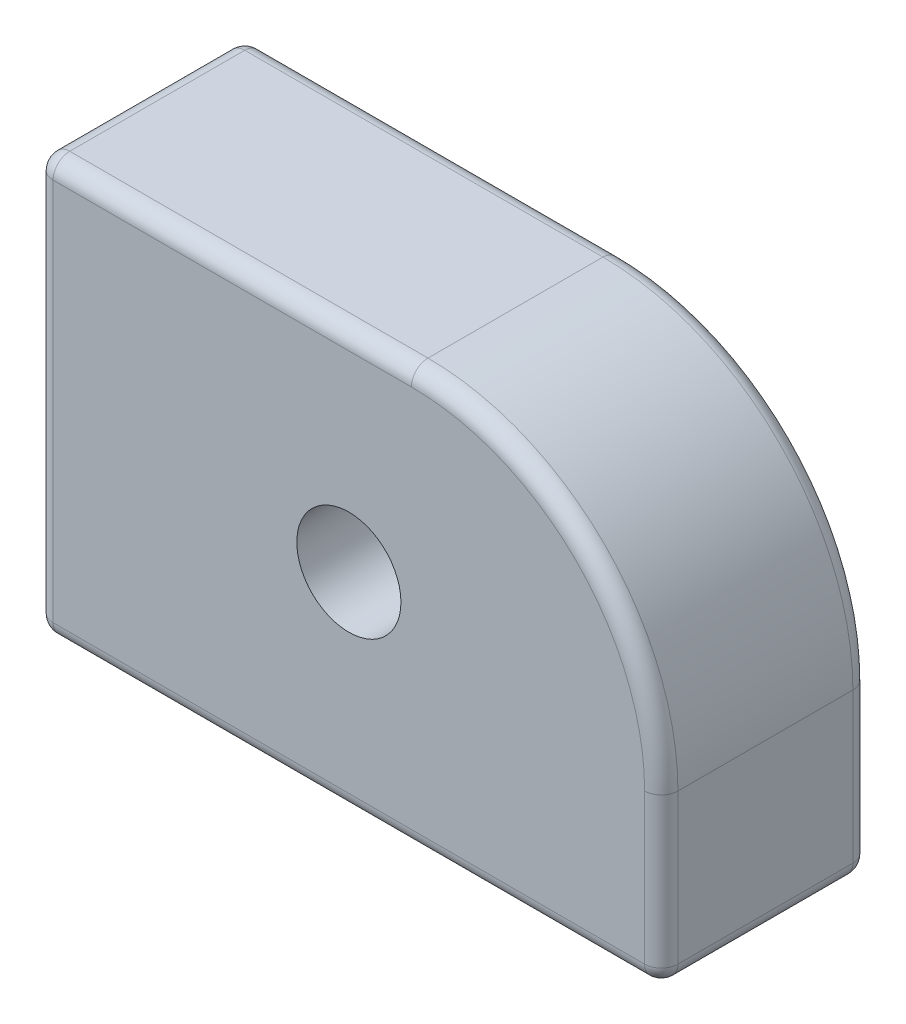
ISO-10303-21;
HEADER;
FILE_DESCRIPTION(('STEP AP214'),'2;1');
FILE_NAME('part.step','',(''),(''),'','','');
FILE_SCHEMA(('AUTOMOTIVE_DESIGN { 1 0 10303 214 1 1 1 1 }'));
ENDSEC;
DATA;
#1=APPLICATION_CONTEXT('core data for automotive mechanical design processes');
#2=APPLICATION_PROTOCOL_DEFINITION('international standard','automotive_design',2000,#1);
#3=PRODUCT_CONTEXT('',#1,'mechanical');
#4=PRODUCT('Part','Part','',(#3));
#5=PRODUCT_RELATED_PRODUCT_CATEGORY('part','',(#4));
#6=PRODUCT_DEFINITION_FORMATION('','',#4);
#7=PRODUCT_DEFINITION_CONTEXT('part definition',#1,'design');
#8=PRODUCT_DEFINITION('design','',#6,#7);
#9=PRODUCT_DEFINITION_SHAPE('','',#8);
#10=(LENGTH_UNIT() NAMED_UNIT(*) SI_UNIT(.MILLI.,.METRE.));
#11=(NAMED_UNIT(*) PLANE_ANGLE_UNIT() SI_UNIT($,.RADIAN.));
#12=(NAMED_UNIT(*) SI_UNIT($,.STERADIAN.) SOLID_ANGLE_UNIT());
#13=UNCERTAINTY_MEASURE_WITH_UNIT(LENGTH_MEASURE(1.E-05),#10,'distance_accuracy_value','');
#14=(GEOMETRIC_REPRESENTATION_CONTEXT(3) GLOBAL_UNCERTAINTY_ASSIGNED_CONTEXT((#13)) GLOBAL_UNIT_ASSIGNED_CONTEXT((#10,
#11,#12)) REPRESENTATION_CONTEXT('',''));
#15=CARTESIAN_POINT('',(0.,0.,0.));
#16=DIRECTION('',(0.,0.,1.));
#17=DIRECTION('',(1.,0.,0.));
#18=AXIS2_PLACEMENT_3D('',#15,#16,#17);
#19=CARTESIAN_POINT('',(-75.,50.,-25.));
#20=DIRECTION('',(0.,1.,0.));
#21=DIRECTION('',(0.,0.,1.));
#22=AXIS2_PLACEMENT_3D('',#19,#20,#21);
#23=PLANE('',#22);
#24=DIRECTION('',(0.,0.,1.));
#25=VECTOR('',#24,1.);
#26=CARTESIAN_POINT('',(-71.,50.,-25.));
#27=LINE('',#26,#25);
#28=CARTESIAN_POINT('',(-71.,50.,-21.));
#29=VERTEX_POINT('',#28);
#30=CARTESIAN_POINT('',(-71.,50.,21.));
#31=VERTEX_POINT('',#30);
#32=EDGE_CURVE('E193',#29,#31,#27,.T.);
#33=ORIENTED_EDGE('',*,*,#32,.T.);
#34=DIRECTION('',(-1.,0.,0.));
#35=VECTOR('',#34,1.);
#36=CARTESIAN_POINT('',(14.9999999999996,50.,21.));
#37=LINE('',#36,#35);
#38=CARTESIAN_POINT('',(14.9999999999996,50.,21.));
#39=VERTEX_POINT('',#38);
#40=EDGE_CURVE('E195',#31,#39,#37,.F.);
#41=ORIENTED_EDGE('',*,*,#40,.T.);
#42=DIRECTION('',(0.,0.,1.));
#43=VECTOR('',#42,1.);
#44=CARTESIAN_POINT('',(14.9999999999996,50.,-25.));
#45=LINE('',#44,#43);
#46=CARTESIAN_POINT('',(14.9999999999996,50.,-21.));
#47=VERTEX_POINT('',#46);
#48=EDGE_CURVE('E152',#47,#39,#45,.T.);
#49=ORIENTED_EDGE('',*,*,#48,.F.);
#50=DIRECTION('',(-1.,0.,0.));
#51=VECTOR('',#50,1.);
#52=CARTESIAN_POINT('',(-75.,50.,-21.));
#53=LINE('',#52,#51);
#54=EDGE_CURVE('E191',#47,#29,#53,.T.);
#55=ORIENTED_EDGE('',*,*,#54,.T.);
#56=EDGE_LOOP('',(#33,#41,#49,#55));
#57=FACE_BOUND('',#56,.T.);
#58=ADVANCED_FACE('F35',(#57),#23,.T.);
#59=CARTESIAN_POINT('',(15.,-9.99999999999999,-25.));
#60=DIRECTION('',(0.,0.,1.));
#61=DIRECTION('',(1.,0.,0.));
#62=AXIS2_PLACEMENT_3D('',#59,#60,#61);
#63=CYLINDRICAL_SURFACE('',#62,60.);
#64=ORIENTED_EDGE('',*,*,#48,.T.);
#65=CARTESIAN_POINT('',(15.,-9.99999999999999,21.));
#66=DIRECTION('',(0.,0.,-1.));
#67=DIRECTION('',(-1.,0.,0.));
#68=AXIS2_PLACEMENT_3D('',#65,#66,#67);
#69=CIRCLE('',#68,60.);
#70=CARTESIAN_POINT('',(75.,-10.0000000000004,21.));
#71=VERTEX_POINT('',#70);
#72=EDGE_CURVE('E139',#39,#71,#69,.T.);
#73=ORIENTED_EDGE('',*,*,#72,.T.);
#74=DIRECTION('',(0.,0.,1.));
#75=VECTOR('',#74,1.);
#76=CARTESIAN_POINT('',(75.,-10.0000000000004,-25.));
#77=LINE('',#76,#75);
#78=CARTESIAN_POINT('',(75.,-10.0000000000004,-21.));
#79=VERTEX_POINT('',#78);
#80=EDGE_CURVE('E274',#79,#71,#77,.T.);
#81=ORIENTED_EDGE('',*,*,#80,.F.);
#82=CARTESIAN_POINT('',(15.,-9.99999999999999,-21.));
#83=DIRECTION('',(0.,0.,-1.));
#84=DIRECTION('',(-1.,0.,0.));
#85=AXIS2_PLACEMENT_3D('',#82,#83,#84);
#86=CIRCLE('',#85,60.);
#87=EDGE_CURVE('E159',#79,#47,#86,.F.);
#88=ORIENTED_EDGE('',*,*,#87,.T.);
#89=EDGE_LOOP('',(#64,#73,#81,#88));
#90=FACE_BOUND('',#89,.T.);
#91=ADVANCED_FACE('F297',(#90),#63,.T.);
#92=CARTESIAN_POINT('',(75.,-10.0000000000004,-25.));
#93=DIRECTION('',(1.,0.,0.));
#94=DIRECTION('',(0.,0.,-1.));
#95=AXIS2_PLACEMENT_3D('',#92,#93,#94);
#96=PLANE('',#95);
#97=ORIENTED_EDGE('',*,*,#80,.T.);
#98=DIRECTION('',(0.,1.,0.));
#99=VECTOR('',#98,1.);
#100=CARTESIAN_POINT('',(75.,-50.,21.));
#101=LINE('',#100,#99);
#102=CARTESIAN_POINT('',(75.,-46.,21.));
#103=VERTEX_POINT('',#102);
#104=EDGE_CURVE('E171',#71,#103,#101,.F.);
#105=ORIENTED_EDGE('',*,*,#104,.T.);
#106=DIRECTION('',(0.,0.,1.));
#107=VECTOR('',#106,1.);
#108=CARTESIAN_POINT('',(75.,-46.,-25.));
#109=LINE('',#108,#107);
#110=CARTESIAN_POINT('',(75.,-46.,-21.));
#111=VERTEX_POINT('',#110);
#112=EDGE_CURVE('E169',#103,#111,#109,.F.);
#113=ORIENTED_EDGE('',*,*,#112,.T.);
#114=DIRECTION('',(0.,1.,0.));
#115=VECTOR('',#114,1.);
#116=CARTESIAN_POINT('',(75.,-10.0000000000004,-21.));
#117=LINE('',#116,#115);
#118=EDGE_CURVE('E167',#111,#79,#117,.T.);
#119=ORIENTED_EDGE('',*,*,#118,.T.);
#120=EDGE_LOOP('',(#97,#105,#113,#119));
#121=FACE_BOUND('',#120,.T.);
#122=ADVANCED_FACE('F300',(#121),#96,.T.);
#123=CARTESIAN_POINT('',(-75.,-50.,-25.));
#124=DIRECTION('',(0.,-1.,0.));
#125=DIRECTION('',(1.,0.,0.));
#126=AXIS2_PLACEMENT_3D('',#123,#124,#125);
#127=PLANE('',#126);
#128=DIRECTION('',(1.,0.,0.));
#129=VECTOR('',#128,1.);
#130=CARTESIAN_POINT('',(-75.,-50.,21.));
#131=LINE('',#130,#129);
#132=CARTESIAN_POINT('',(71.,-50.,21.));
#133=VERTEX_POINT('',#132);
#134=CARTESIAN_POINT('',(-71.,-50.,21.));
#135=VERTEX_POINT('',#134);
#136=EDGE_CURVE('E177',#133,#135,#131,.F.);
#137=ORIENTED_EDGE('',*,*,#136,.T.);
#138=DIRECTION('',(0.,0.,1.));
#139=VECTOR('',#138,1.);
#140=CARTESIAN_POINT('',(-71.,-50.,-25.));
#141=LINE('',#140,#139);
#142=CARTESIAN_POINT('',(-71.,-50.,-21.));
#143=VERTEX_POINT('',#142);
#144=EDGE_CURVE('E180',#135,#143,#141,.F.);
#145=ORIENTED_EDGE('',*,*,#144,.T.);
#146=DIRECTION('',(1.,0.,0.));
#147=VECTOR('',#146,1.);
#148=CARTESIAN_POINT('',(-75.,-50.,-21.));
#149=LINE('',#148,#147);
#150=CARTESIAN_POINT('',(71.,-50.,-21.));
#151=VERTEX_POINT('',#150);
#152=EDGE_CURVE('E175',#143,#151,#149,.T.);
#153=ORIENTED_EDGE('',*,*,#152,.T.);
#154=DIRECTION('',(0.,0.,1.));
#155=VECTOR('',#154,1.);
#156=CARTESIAN_POINT('',(71.,-50.,-25.));
#157=LINE('',#156,#155);
#158=EDGE_CURVE('E173',#151,#133,#157,.T.);
#159=ORIENTED_EDGE('',*,*,#158,.T.);
#160=EDGE_LOOP('',(#137,#145,#153,#159));
#161=FACE_BOUND('',#160,.T.);
#162=ADVANCED_FACE('F311',(#161),#127,.T.);
#163=CARTESIAN_POINT('',(-75.,-50.,-25.));
#164=DIRECTION('',(-1.,0.,0.));
#165=DIRECTION('',(0.,0.,1.));
#166=AXIS2_PLACEMENT_3D('',#163,#164,#165);
#167=PLANE('',#166);
#168=DIRECTION('',(0.,-1.,0.));
#169=VECTOR('',#168,1.);
#170=CARTESIAN_POINT('',(-75.,-50.,-21.));
#171=LINE('',#170,#169);
#172=CARTESIAN_POINT('',(-75.,46.,-21.));
#173=VERTEX_POINT('',#172);
#174=CARTESIAN_POINT('',(-75.,-46.,-21.));
#175=VERTEX_POINT('',#174);
#176=EDGE_CURVE('E184',#173,#175,#171,.T.);
#177=ORIENTED_EDGE('',*,*,#176,.T.);
#178=DIRECTION('',(0.,0.,1.));
#179=VECTOR('',#178,1.);
#180=CARTESIAN_POINT('',(-75.,-46.,-25.));
#181=LINE('',#180,#179);
#182=CARTESIAN_POINT('',(-75.,-46.,21.));
#183=VERTEX_POINT('',#182);
#184=EDGE_CURVE('E189',#175,#183,#181,.T.);
#185=ORIENTED_EDGE('',*,*,#184,.T.);
#186=DIRECTION('',(0.,-1.,0.));
#187=VECTOR('',#186,1.);
#188=CARTESIAN_POINT('',(-75.,50.,21.));
#189=LINE('',#188,#187);
#190=CARTESIAN_POINT('',(-75.,46.,21.));
#191=VERTEX_POINT('',#190);
#192=EDGE_CURVE('E186',#183,#191,#189,.F.);
#193=ORIENTED_EDGE('',*,*,#192,.T.);
#194=DIRECTION('',(0.,0.,1.));
#195=VECTOR('',#194,1.);
#196=CARTESIAN_POINT('',(-75.,46.,-25.));
#197=LINE('',#196,#195);
#198=EDGE_CURVE('E182',#191,#173,#197,.F.);
#199=ORIENTED_EDGE('',*,*,#198,.T.);
#200=EDGE_LOOP('',(#177,#185,#193,#199));
#201=FACE_BOUND('',#200,.T.);
#202=CARTESIAN_POINT('',(-75.,0.,0.));
#203=DIRECTION('',(-1.,0.,0.));
#204=DIRECTION('',(0.,0.,1.));
#205=AXIS2_PLACEMENT_3D('',#202,#203,#204);
#206=CIRCLE('',#205,15.);
#207=CARTESIAN_POINT('',(-75.,0.,15.));
#208=VERTEX_POINT('',#207);
#209=EDGE_CURVE('E258',#208,#208,#206,.T.);
#210=ORIENTED_EDGE('',*,*,#209,.F.);
#211=EDGE_LOOP('',(#210));
#212=FACE_BOUND('',#211,.T.);
#213=ADVANCED_FACE('F352',(#201,#212),#167,.T.);
#214=CARTESIAN_POINT('',(15.,-9.99999999999999,-25.));
#215=DIRECTION('',(0.,0.,-1.));
#216=DIRECTION('',(-1.,0.,0.));
#217=AXIS2_PLACEMENT_3D('',#214,#215,#216);
#218=PLANE('',#217);
#219=DIRECTION('',(0.,1.,0.));
#220=VECTOR('',#219,1.);
#221=CARTESIAN_POINT('',(71.,-9.99999999999999,-25.));
#222=LINE('',#221,#220);
#223=CARTESIAN_POINT('',(71.,-10.0000000000004,-25.));
#224=VERTEX_POINT('',#223);
#225=CARTESIAN_POINT('',(71.,-46.,-25.));
#226=VERTEX_POINT('',#225);
#227=EDGE_CURVE('E58',#224,#226,#222,.F.);
#228=ORIENTED_EDGE('',*,*,#227,.T.);
#229=DIRECTION('',(1.,0.,0.));
#230=VECTOR('',#229,1.);
#231=CARTESIAN_POINT('',(15.,-46.,-25.));
#232=LINE('',#231,#230);
#233=CARTESIAN_POINT('',(-71.,-46.,-25.));
#234=VERTEX_POINT('',#233);
#235=EDGE_CURVE('E11',#226,#234,#232,.F.);
#236=ORIENTED_EDGE('',*,*,#235,.T.);
#237=DIRECTION('',(0.,-1.,0.));
#238=VECTOR('',#237,1.);
#239=CARTESIAN_POINT('',(-71.,-9.99999999999999,-25.));
#240=LINE('',#239,#238);
#241=CARTESIAN_POINT('',(-71.,46.,-25.));
#242=VERTEX_POINT('',#241);
#243=EDGE_CURVE('E44',#234,#242,#240,.F.);
#244=ORIENTED_EDGE('',*,*,#243,.T.);
#245=DIRECTION('',(-1.,0.,0.));
#246=VECTOR('',#245,1.);
#247=CARTESIAN_POINT('',(15.,46.,-25.));
#248=LINE('',#247,#246);
#249=CARTESIAN_POINT('',(14.9999999999996,46.,-25.));
#250=VERTEX_POINT('',#249);
#251=EDGE_CURVE('E197',#242,#250,#248,.F.);
#252=ORIENTED_EDGE('',*,*,#251,.T.);
#253=CARTESIAN_POINT('',(15.,-9.99999999999999,-25.));
#254=DIRECTION('',(0.,0.,-1.));
#255=DIRECTION('',(-1.,0.,0.));
#256=AXIS2_PLACEMENT_3D('',#253,#254,#255);
#257=CIRCLE('',#256,56.);
#258=EDGE_CURVE('E199',#250,#224,#257,.T.);
#259=ORIENTED_EDGE('',*,*,#258,.T.);
#260=EDGE_LOOP('',(#228,#236,#244,#252,#259));
#261=FACE_BOUND('',#260,.T.);
#262=CARTESIAN_POINT('',(0.,0.,-25.));
#263=DIRECTION('',(0.,0.,1.));
#264=DIRECTION('',(1.,0.,0.));
#265=AXIS2_PLACEMENT_3D('',#262,#263,#264);
#266=CIRCLE('',#265,12.5);
#267=CARTESIAN_POINT('',(12.5,0.,-25.));
#268=VERTEX_POINT('',#267);
#269=EDGE_CURVE('E271',#268,#268,#266,.T.);
#270=ORIENTED_EDGE('',*,*,#269,.T.);
#271=EDGE_LOOP('',(#270));
#272=FACE_BOUND('',#271,.T.);
#273=ADVANCED_FACE('F314',(#261,#272),#218,.T.);
#274=CARTESIAN_POINT('',(15.,-9.99999999999999,25.));
#275=DIRECTION('',(0.,0.,-1.));
#276=DIRECTION('',(-1.,0.,0.));
#277=AXIS2_PLACEMENT_3D('',#274,#275,#276);
#278=PLANE('',#277);
#279=DIRECTION('',(0.,1.,0.));
#280=VECTOR('',#279,1.);
#281=CARTESIAN_POINT('',(71.,-10.0000000000004,25.));
#282=LINE('',#281,#280);
#283=CARTESIAN_POINT('',(71.,-46.,25.));
#284=VERTEX_POINT('',#283);
#285=CARTESIAN_POINT('',(71.,-10.0000000000004,25.));
#286=VERTEX_POINT('',#285);
#287=EDGE_CURVE('E157',#284,#286,#282,.T.);
#288=ORIENTED_EDGE('',*,*,#287,.T.);
#289=CARTESIAN_POINT('',(15.,-9.99999999999999,25.));
#290=DIRECTION('',(0.,0.,-1.));
#291=DIRECTION('',(-1.,0.,0.));
#292=AXIS2_PLACEMENT_3D('',#289,#290,#291);
#293=CIRCLE('',#292,56.);
#294=CARTESIAN_POINT('',(14.9999999999996,46.,25.));
#295=VERTEX_POINT('',#294);
#296=EDGE_CURVE('E137',#286,#295,#293,.F.);
#297=ORIENTED_EDGE('',*,*,#296,.T.);
#298=DIRECTION('',(-1.,0.,0.));
#299=VECTOR('',#298,1.);
#300=CARTESIAN_POINT('',(-75.,46.,25.));
#301=LINE('',#300,#299);
#302=CARTESIAN_POINT('',(-71.,46.,25.));
#303=VERTEX_POINT('',#302);
#304=EDGE_CURVE('E145',#295,#303,#301,.T.);
#305=ORIENTED_EDGE('',*,*,#304,.T.);
#306=DIRECTION('',(0.,-1.,0.));
#307=VECTOR('',#306,1.);
#308=CARTESIAN_POINT('',(-71.,-50.,25.));
#309=LINE('',#308,#307);
#310=CARTESIAN_POINT('',(-71.,-46.,25.));
#311=VERTEX_POINT('',#310);
#312=EDGE_CURVE('E151',#303,#311,#309,.T.);
#313=ORIENTED_EDGE('',*,*,#312,.T.);
#314=DIRECTION('',(1.,0.,0.));
#315=VECTOR('',#314,1.);
#316=CARTESIAN_POINT('',(75.,-46.,25.));
#317=LINE('',#316,#315);
#318=EDGE_CURVE('E162',#311,#284,#317,.T.);
#319=ORIENTED_EDGE('',*,*,#318,.T.);
#320=EDGE_LOOP('',(#288,#297,#305,#313,#319));
#321=FACE_BOUND('',#320,.T.);
#322=CARTESIAN_POINT('',(0.,0.,25.));
#323=DIRECTION('',(0.,0.,1.));
#324=DIRECTION('',(1.,0.,0.));
#325=AXIS2_PLACEMENT_3D('',#322,#323,#324);
#326=CIRCLE('',#325,12.5);
#327=CARTESIAN_POINT('',(12.5,0.,25.));
#328=VERTEX_POINT('',#327);
#329=EDGE_CURVE('E268',#328,#328,#326,.T.);
#330=ORIENTED_EDGE('',*,*,#329,.F.);
#331=EDGE_LOOP('',(#330));
#332=FACE_BOUND('',#331,.T.);
#333=ADVANCED_FACE('F154',(#321,#332),#278,.F.);
#334=CARTESIAN_POINT('',(0.,0.,-25.));
#335=DIRECTION('',(0.,0.,1.));
#336=DIRECTION('',(1.,0.,0.));
#337=AXIS2_PLACEMENT_3D('',#334,#335,#336);
#338=CYLINDRICAL_SURFACE('',#337,12.5);
#339=ORIENTED_EDGE('',*,*,#269,.F.);
#340=EDGE_LOOP('',(#339));
#341=FACE_BOUND('',#340,.T.);
#342=ORIENTED_EDGE('',*,*,#329,.T.);
#343=EDGE_LOOP('',(#342));
#344=FACE_BOUND('',#343,.T.);
#345=ADVANCED_FACE('F520',(#341,#344),#338,.F.);
#346=CARTESIAN_POINT('',(-15.,0.,0.));
#347=DIRECTION('',(-1.,0.,0.));
#348=DIRECTION('',(0.,0.,1.));
#349=AXIS2_PLACEMENT_3D('',#346,#347,#348);
#350=CYLINDRICAL_SURFACE('',#349,15.);
#351=CARTESIAN_POINT('',(-15.,0.,0.));
#352=DIRECTION('',(-1.,0.,0.));
#353=DIRECTION('',(0.,0.,1.));
#354=AXIS2_PLACEMENT_3D('',#351,#352,#353);
#355=CIRCLE('',#354,15.);
#356=CARTESIAN_POINT('',(-15.,0.,15.));
#357=VERTEX_POINT('',#356);
#358=EDGE_CURVE('E263',#357,#357,#355,.T.);
#359=ORIENTED_EDGE('',*,*,#358,.F.);
#360=EDGE_LOOP('',(#359));
#361=FACE_BOUND('',#360,.T.);
#362=ORIENTED_EDGE('',*,*,#209,.T.);
#363=EDGE_LOOP('',(#362));
#364=FACE_BOUND('',#363,.T.);
#365=ADVANCED_FACE('F511',(#361,#364),#350,.F.);
#366=CARTESIAN_POINT('',(-15.,0.,0.));
#367=DIRECTION('',(-1.,0.,0.));
#368=DIRECTION('',(0.,0.,1.));
#369=AXIS2_PLACEMENT_3D('',#366,#367,#368);
#370=PLANE('',#369);
#371=ORIENTED_EDGE('',*,*,#358,.T.);
#372=EDGE_LOOP('',(#371));
#373=FACE_BOUND('',#372,.T.);
#374=ADVANCED_FACE('F342',(#373),#370,.T.);
#375=CARTESIAN_POINT('',(-71.,-46.,-21.));
#376=DIRECTION('',(0.,0.,1.));
#377=DIRECTION('',(1.,0.,0.));
#378=AXIS2_PLACEMENT_3D('',#375,#376,#377);
#379=SPHERICAL_SURFACE('',#378,4.);
#380=CARTESIAN_POINT('',(-71.,-46.,-21.));
#381=DIRECTION('',(0.,-1.,0.));
#382=DIRECTION('',(0.,0.,-1.));
#383=AXIS2_PLACEMENT_3D('',#380,#381,#382);
#384=CIRCLE('',#383,4.);
#385=EDGE_CURVE('E248',#234,#175,#384,.F.);
#386=ORIENTED_EDGE('',*,*,#385,.F.);
#387=CARTESIAN_POINT('',(-71.,-46.,-21.));
#388=DIRECTION('',(-1.,0.,0.));
#389=DIRECTION('',(0.,0.,1.));
#390=AXIS2_PLACEMENT_3D('',#387,#388,#389);
#391=CIRCLE('',#390,4.);
#392=EDGE_CURVE('E252',#143,#234,#391,.F.);
#393=ORIENTED_EDGE('',*,*,#392,.F.);
#394=CARTESIAN_POINT('',(-71.,-46.,-21.));
#395=DIRECTION('',(0.,0.,-1.));
#396=DIRECTION('',(-1.,0.,0.));
#397=AXIS2_PLACEMENT_3D('',#394,#395,#396);
#398=CIRCLE('',#397,4.);
#399=EDGE_CURVE('E250',#175,#143,#398,.F.);
#400=ORIENTED_EDGE('',*,*,#399,.F.);
#401=EDGE_LOOP('',(#386,#393,#400));
#402=FACE_BOUND('',#401,.T.);
#403=ADVANCED_FACE('F37',(#402),#379,.T.);
#404=CARTESIAN_POINT('',(15.,-9.99999999999999,-21.));
#405=DIRECTION('',(0.,0.,-1.));
#406=DIRECTION('',(-1.,0.,0.));
#407=AXIS2_PLACEMENT_3D('',#404,#405,#406);
#408=TOROIDAL_SURFACE('',#407,56.,4.);
#409=CARTESIAN_POINT('',(14.9999999999996,46.,-21.));
#410=DIRECTION('',(-1.,0.,0.));
#411=DIRECTION('',(0.,-1.,0.));
#412=AXIS2_PLACEMENT_3D('',#409,#410,#411);
#413=CIRCLE('',#412,4.);
#414=EDGE_CURVE('E245',#47,#250,#413,.T.);
#415=ORIENTED_EDGE('',*,*,#414,.F.);
#416=ORIENTED_EDGE('',*,*,#87,.F.);
#417=CARTESIAN_POINT('',(71.,-10.0000000000004,-21.));
#418=DIRECTION('',(0.,-1.,0.));
#419=DIRECTION('',(0.,0.,-1.));
#420=AXIS2_PLACEMENT_3D('',#417,#418,#419);
#421=CIRCLE('',#420,4.);
#422=EDGE_CURVE('E39',#224,#79,#421,.T.);
#423=ORIENTED_EDGE('',*,*,#422,.F.);
#424=ORIENTED_EDGE('',*,*,#258,.F.);
#425=EDGE_LOOP('',(#415,#416,#423,#424));
#426=FACE_BOUND('',#425,.T.);
#427=ADVANCED_FACE('F335',(#426),#408,.T.);
#428=CARTESIAN_POINT('',(71.,-10.0000000000004,-21.));
#429=DIRECTION('',(0.,1.,0.));
#430=DIRECTION('',(0.,0.,1.));
#431=AXIS2_PLACEMENT_3D('',#428,#429,#430);
#432=CYLINDRICAL_SURFACE('',#431,4.);
#433=ORIENTED_EDGE('',*,*,#422,.T.);
#434=ORIENTED_EDGE('',*,*,#118,.F.);
#435=CARTESIAN_POINT('',(71.,-46.,-21.));
#436=DIRECTION('',(0.,-1.,0.));
#437=DIRECTION('',(0.,0.,-1.));
#438=AXIS2_PLACEMENT_3D('',#435,#436,#437);
#439=CIRCLE('',#438,4.);
#440=EDGE_CURVE('E242',#226,#111,#439,.T.);
#441=ORIENTED_EDGE('',*,*,#440,.F.);
#442=ORIENTED_EDGE('',*,*,#227,.F.);
#443=EDGE_LOOP('',(#433,#434,#441,#442));
#444=FACE_BOUND('',#443,.T.);
#445=ADVANCED_FACE('F302',(#444),#432,.T.);
#446=CARTESIAN_POINT('',(-75.,-46.,-21.));
#447=DIRECTION('',(1.,0.,0.));
#448=DIRECTION('',(0.,1.,0.));
#449=AXIS2_PLACEMENT_3D('',#446,#447,#448);
#450=CYLINDRICAL_SURFACE('',#449,4.);
#451=ORIENTED_EDGE('',*,*,#392,.T.);
#452=ORIENTED_EDGE('',*,*,#235,.F.);
#453=CARTESIAN_POINT('',(71.,-46.,-21.));
#454=DIRECTION('',(1.,0.,0.));
#455=DIRECTION('',(0.,0.,-1.));
#456=AXIS2_PLACEMENT_3D('',#453,#454,#455);
#457=CIRCLE('',#456,4.);
#458=EDGE_CURVE('E239',#151,#226,#457,.T.);
#459=ORIENTED_EDGE('',*,*,#458,.F.);
#460=ORIENTED_EDGE('',*,*,#152,.F.);
#461=EDGE_LOOP('',(#451,#452,#459,#460));
#462=FACE_BOUND('',#461,.T.);
#463=ADVANCED_FACE('F313',(#462),#450,.T.);
#464=CARTESIAN_POINT('',(-71.,-46.,-25.));
#465=DIRECTION('',(0.,0.,1.));
#466=DIRECTION('',(1.,0.,0.));
#467=AXIS2_PLACEMENT_3D('',#464,#465,#466);
#468=CYLINDRICAL_SURFACE('',#467,4.);
#469=ORIENTED_EDGE('',*,*,#399,.T.);
#470=ORIENTED_EDGE('',*,*,#144,.F.);
#471=CARTESIAN_POINT('',(-71.,-46.,21.));
#472=DIRECTION('',(0.,0.,1.));
#473=DIRECTION('',(1.,0.,0.));
#474=AXIS2_PLACEMENT_3D('',#471,#472,#473);
#475=CIRCLE('',#474,4.);
#476=EDGE_CURVE('E236',#183,#135,#475,.T.);
#477=ORIENTED_EDGE('',*,*,#476,.F.);
#478=ORIENTED_EDGE('',*,*,#184,.F.);
#479=EDGE_LOOP('',(#469,#470,#477,#478));
#480=FACE_BOUND('',#479,.T.);
#481=ADVANCED_FACE('F388',(#480),#468,.T.);
#482=CARTESIAN_POINT('',(-71.,-50.,-21.));
#483=DIRECTION('',(0.,-1.,0.));
#484=DIRECTION('',(0.,0.,-1.));
#485=AXIS2_PLACEMENT_3D('',#482,#483,#484);
#486=CYLINDRICAL_SURFACE('',#485,4.);
#487=ORIENTED_EDGE('',*,*,#385,.T.);
#488=ORIENTED_EDGE('',*,*,#176,.F.);
#489=CARTESIAN_POINT('',(-71.,46.,-21.));
#490=DIRECTION('',(0.,1.,0.));
#491=DIRECTION('',(0.,0.,1.));
#492=AXIS2_PLACEMENT_3D('',#489,#490,#491);
#493=CIRCLE('',#492,4.);
#494=EDGE_CURVE('E233',#242,#173,#493,.T.);
#495=ORIENTED_EDGE('',*,*,#494,.F.);
#496=ORIENTED_EDGE('',*,*,#243,.F.);
#497=EDGE_LOOP('',(#487,#488,#495,#496));
#498=FACE_BOUND('',#497,.T.);
#499=ADVANCED_FACE('F325',(#498),#486,.T.);
#500=CARTESIAN_POINT('',(-75.,46.,-21.));
#501=DIRECTION('',(-1.,0.,0.));
#502=DIRECTION('',(0.,0.,1.));
#503=AXIS2_PLACEMENT_3D('',#500,#501,#502);
#504=CYLINDRICAL_SURFACE('',#503,4.);
#505=ORIENTED_EDGE('',*,*,#414,.T.);
#506=ORIENTED_EDGE('',*,*,#251,.F.);
#507=CARTESIAN_POINT('',(-71.,46.,-21.));
#508=DIRECTION('',(-1.,0.,0.));
#509=DIRECTION('',(0.,0.,1.));
#510=AXIS2_PLACEMENT_3D('',#507,#508,#509);
#511=CIRCLE('',#510,4.);
#512=EDGE_CURVE('E230',#29,#242,#511,.T.);
#513=ORIENTED_EDGE('',*,*,#512,.F.);
#514=ORIENTED_EDGE('',*,*,#54,.F.);
#515=EDGE_LOOP('',(#505,#506,#513,#514));
#516=FACE_BOUND('',#515,.T.);
#517=ADVANCED_FACE('F320',(#516),#504,.T.);
#518=CARTESIAN_POINT('',(71.,-46.,-21.));
#519=DIRECTION('',(0.,0.,1.));
#520=DIRECTION('',(1.,0.,0.));
#521=AXIS2_PLACEMENT_3D('',#518,#519,#520);
#522=SPHERICAL_SURFACE('',#521,4.);
#523=ORIENTED_EDGE('',*,*,#458,.T.);
#524=ORIENTED_EDGE('',*,*,#440,.T.);
#525=CARTESIAN_POINT('',(71.,-46.,-21.));
#526=DIRECTION('',(0.,0.,-1.));
#527=DIRECTION('',(-1.,0.,0.));
#528=AXIS2_PLACEMENT_3D('',#525,#526,#527);
#529=CIRCLE('',#528,4.);
#530=EDGE_CURVE('E227',#151,#111,#529,.F.);
#531=ORIENTED_EDGE('',*,*,#530,.F.);
#532=EDGE_LOOP('',(#523,#524,#531));
#533=FACE_BOUND('',#532,.T.);
#534=ADVANCED_FACE('F305',(#533),#522,.T.);
#535=CARTESIAN_POINT('',(-71.,-46.,21.));
#536=DIRECTION('',(0.,0.,1.));
#537=DIRECTION('',(1.,0.,0.));
#538=AXIS2_PLACEMENT_3D('',#535,#536,#537);
#539=SPHERICAL_SURFACE('',#538,4.);
#540=CARTESIAN_POINT('',(-71.,-46.,21.));
#541=DIRECTION('',(0.,-1.,0.));
#542=DIRECTION('',(0.,0.,-1.));
#543=AXIS2_PLACEMENT_3D('',#540,#541,#542);
#544=CIRCLE('',#543,4.);
#545=EDGE_CURVE('E222',#183,#311,#544,.F.);
#546=ORIENTED_EDGE('',*,*,#545,.F.);
#547=ORIENTED_EDGE('',*,*,#476,.T.);
#548=CARTESIAN_POINT('',(-71.,-46.,21.));
#549=DIRECTION('',(-1.,0.,0.));
#550=DIRECTION('',(0.,0.,1.));
#551=AXIS2_PLACEMENT_3D('',#548,#549,#550);
#552=CIRCLE('',#551,4.);
#553=EDGE_CURVE('E225',#311,#135,#552,.F.);
#554=ORIENTED_EDGE('',*,*,#553,.F.);
#555=EDGE_LOOP('',(#546,#547,#554));
#556=FACE_BOUND('',#555,.T.);
#557=ADVANCED_FACE('F378',(#556),#539,.T.);
#558=CARTESIAN_POINT('',(-71.,46.,-21.));
#559=DIRECTION('',(0.,0.,1.));
#560=DIRECTION('',(1.,0.,0.));
#561=AXIS2_PLACEMENT_3D('',#558,#559,#560);
#562=SPHERICAL_SURFACE('',#561,4.);
#563=ORIENTED_EDGE('',*,*,#512,.T.);
#564=ORIENTED_EDGE('',*,*,#494,.T.);
#565=CARTESIAN_POINT('',(-71.,46.,-21.));
#566=DIRECTION('',(0.,0.,-1.));
#567=DIRECTION('',(-1.,0.,0.));
#568=AXIS2_PLACEMENT_3D('',#565,#566,#567);
#569=CIRCLE('',#568,4.);
#570=EDGE_CURVE('E219',#29,#173,#569,.F.);
#571=ORIENTED_EDGE('',*,*,#570,.F.);
#572=EDGE_LOOP('',(#563,#564,#571));
#573=FACE_BOUND('',#572,.T.);
#574=ADVANCED_FACE('F327',(#573),#562,.T.);
#575=CARTESIAN_POINT('',(71.,-46.,-25.));
#576=DIRECTION('',(0.,0.,1.));
#577=DIRECTION('',(1.,0.,0.));
#578=AXIS2_PLACEMENT_3D('',#575,#576,#577);
#579=CYLINDRICAL_SURFACE('',#578,4.);
#580=ORIENTED_EDGE('',*,*,#530,.T.);
#581=ORIENTED_EDGE('',*,*,#112,.F.);
#582=CARTESIAN_POINT('',(71.,-46.,21.));
#583=DIRECTION('',(0.,0.,1.));
#584=DIRECTION('',(1.,0.,0.));
#585=AXIS2_PLACEMENT_3D('',#582,#583,#584);
#586=CIRCLE('',#585,4.);
#587=EDGE_CURVE('E216',#133,#103,#586,.T.);
#588=ORIENTED_EDGE('',*,*,#587,.F.);
#589=ORIENTED_EDGE('',*,*,#158,.F.);
#590=EDGE_LOOP('',(#580,#581,#588,#589));
#591=FACE_BOUND('',#590,.T.);
#592=ADVANCED_FACE('F309',(#591),#579,.T.);
#593=CARTESIAN_POINT('',(15.,-46.,21.));
#594=DIRECTION('',(-1.,0.,0.));
#595=DIRECTION('',(0.,-1.,0.));
#596=AXIS2_PLACEMENT_3D('',#593,#594,#595);
#597=CYLINDRICAL_SURFACE('',#596,4.);
#598=ORIENTED_EDGE('',*,*,#553,.T.);
#599=ORIENTED_EDGE('',*,*,#136,.F.);
#600=CARTESIAN_POINT('',(71.,-46.,21.));
#601=DIRECTION('',(1.,0.,0.));
#602=DIRECTION('',(0.,0.,-1.));
#603=AXIS2_PLACEMENT_3D('',#600,#601,#602);
#604=CIRCLE('',#603,4.);
#605=EDGE_CURVE('E213',#284,#133,#604,.T.);
#606=ORIENTED_EDGE('',*,*,#605,.F.);
#607=ORIENTED_EDGE('',*,*,#318,.F.);
#608=EDGE_LOOP('',(#598,#599,#606,#607));
#609=FACE_BOUND('',#608,.T.);
#610=ADVANCED_FACE('F286',(#609),#597,.T.);
#611=CARTESIAN_POINT('',(-71.,-9.99999999999999,21.));
#612=DIRECTION('',(0.,1.,0.));
#613=DIRECTION('',(0.,0.,1.));
#614=AXIS2_PLACEMENT_3D('',#611,#612,#613);
#615=CYLINDRICAL_SURFACE('',#614,4.);
#616=ORIENTED_EDGE('',*,*,#545,.T.);
#617=ORIENTED_EDGE('',*,*,#312,.F.);
#618=CARTESIAN_POINT('',(-71.,46.,21.));
#619=DIRECTION('',(0.,1.,0.));
#620=DIRECTION('',(0.,0.,1.));
#621=AXIS2_PLACEMENT_3D('',#618,#619,#620);
#622=CIRCLE('',#621,4.);
#623=EDGE_CURVE('E210',#191,#303,#622,.T.);
#624=ORIENTED_EDGE('',*,*,#623,.F.);
#625=ORIENTED_EDGE('',*,*,#192,.F.);
#626=EDGE_LOOP('',(#616,#617,#624,#625));
#627=FACE_BOUND('',#626,.T.);
#628=ADVANCED_FACE('F368',(#627),#615,.T.);
#629=CARTESIAN_POINT('',(-71.,46.,-25.));
#630=DIRECTION('',(0.,0.,1.));
#631=DIRECTION('',(1.,0.,0.));
#632=AXIS2_PLACEMENT_3D('',#629,#630,#631);
#633=CYLINDRICAL_SURFACE('',#632,4.);
#634=ORIENTED_EDGE('',*,*,#570,.T.);
#635=ORIENTED_EDGE('',*,*,#198,.F.);
#636=CARTESIAN_POINT('',(-71.,46.,21.));
#637=DIRECTION('',(0.,0.,1.));
#638=DIRECTION('',(1.,0.,0.));
#639=AXIS2_PLACEMENT_3D('',#636,#637,#638);
#640=CIRCLE('',#639,4.);
#641=EDGE_CURVE('E208',#31,#191,#640,.T.);
#642=ORIENTED_EDGE('',*,*,#641,.F.);
#643=ORIENTED_EDGE('',*,*,#32,.F.);
#644=EDGE_LOOP('',(#634,#635,#642,#643));
#645=FACE_BOUND('',#644,.T.);
#646=ADVANCED_FACE('F332',(#645),#633,.T.);
#647=CARTESIAN_POINT('',(71.,-46.,21.));
#648=DIRECTION('',(0.,0.,1.));
#649=DIRECTION('',(1.,0.,0.));
#650=AXIS2_PLACEMENT_3D('',#647,#648,#649);
#651=SPHERICAL_SURFACE('',#650,4.);
#652=ORIENTED_EDGE('',*,*,#605,.T.);
#653=ORIENTED_EDGE('',*,*,#587,.T.);
#654=CARTESIAN_POINT('',(71.,-46.,21.));
#655=DIRECTION('',(0.,-1.,0.));
#656=DIRECTION('',(0.,0.,-1.));
#657=AXIS2_PLACEMENT_3D('',#654,#655,#656);
#658=CIRCLE('',#657,4.);
#659=EDGE_CURVE('E205',#284,#103,#658,.F.);
#660=ORIENTED_EDGE('',*,*,#659,.F.);
#661=EDGE_LOOP('',(#652,#653,#660));
#662=FACE_BOUND('',#661,.T.);
#663=ADVANCED_FACE('F289',(#662),#651,.T.);
#664=CARTESIAN_POINT('',(-71.,46.,21.));
#665=DIRECTION('',(0.,0.,1.));
#666=DIRECTION('',(1.,0.,0.));
#667=AXIS2_PLACEMENT_3D('',#664,#665,#666);
#668=SPHERICAL_SURFACE('',#667,4.);
#669=ORIENTED_EDGE('',*,*,#641,.T.);
#670=ORIENTED_EDGE('',*,*,#623,.T.);
#671=CARTESIAN_POINT('',(-71.,46.,21.));
#672=DIRECTION('',(-1.,0.,0.));
#673=DIRECTION('',(0.,-1.,0.));
#674=AXIS2_PLACEMENT_3D('',#671,#672,#673);
#675=CIRCLE('',#674,4.);
#676=EDGE_CURVE('E148',#31,#303,#675,.F.);
#677=ORIENTED_EDGE('',*,*,#676,.F.);
#678=EDGE_LOOP('',(#669,#670,#677));
#679=FACE_BOUND('',#678,.T.);
#680=ADVANCED_FACE('F360',(#679),#668,.T.);
#681=CARTESIAN_POINT('',(71.,-9.99999999999999,21.));
#682=DIRECTION('',(0.,-1.,0.));
#683=DIRECTION('',(0.,0.,-1.));
#684=AXIS2_PLACEMENT_3D('',#681,#682,#683);
#685=CYLINDRICAL_SURFACE('',#684,4.);
#686=ORIENTED_EDGE('',*,*,#659,.T.);
#687=ORIENTED_EDGE('',*,*,#104,.F.);
#688=CARTESIAN_POINT('',(71.,-10.0000000000004,21.));
#689=DIRECTION('',(0.,1.,0.));
#690=DIRECTION('',(-1.,0.,0.));
#691=AXIS2_PLACEMENT_3D('',#688,#689,#690);
#692=CIRCLE('',#691,4.);
#693=EDGE_CURVE('E142',#286,#71,#692,.T.);
#694=ORIENTED_EDGE('',*,*,#693,.F.);
#695=ORIENTED_EDGE('',*,*,#287,.F.);
#696=EDGE_LOOP('',(#686,#687,#694,#695));
#697=FACE_BOUND('',#696,.T.);
#698=ADVANCED_FACE('F292',(#697),#685,.T.);
#699=CARTESIAN_POINT('',(15.,46.,21.));
#700=DIRECTION('',(1.,0.,0.));
#701=DIRECTION('',(0.,0.,-1.));
#702=AXIS2_PLACEMENT_3D('',#699,#700,#701);
#703=CYLINDRICAL_SURFACE('',#702,4.);
#704=ORIENTED_EDGE('',*,*,#676,.T.);
#705=ORIENTED_EDGE('',*,*,#304,.F.);
#706=CARTESIAN_POINT('',(14.9999999999996,46.,21.));
#707=DIRECTION('',(1.,0.,0.));
#708=DIRECTION('',(0.,0.,-1.));
#709=AXIS2_PLACEMENT_3D('',#706,#707,#708);
#710=CIRCLE('',#709,4.);
#711=EDGE_CURVE('E133',#39,#295,#710,.T.);
#712=ORIENTED_EDGE('',*,*,#711,.F.);
#713=ORIENTED_EDGE('',*,*,#40,.F.);
#714=EDGE_LOOP('',(#704,#705,#712,#713));
#715=FACE_BOUND('',#714,.T.);
#716=ADVANCED_FACE('F146',(#715),#703,.T.);
#717=CARTESIAN_POINT('',(15.,-9.99999999999999,21.));
#718=DIRECTION('',(0.,0.,-1.));
#719=DIRECTION('',(-1.,0.,0.));
#720=AXIS2_PLACEMENT_3D('',#717,#718,#719);
#721=TOROIDAL_SURFACE('',#720,56.,4.);
#722=ORIENTED_EDGE('',*,*,#693,.T.);
#723=ORIENTED_EDGE('',*,*,#72,.F.);
#724=ORIENTED_EDGE('',*,*,#711,.T.);
#725=ORIENTED_EDGE('',*,*,#296,.F.);
#726=EDGE_LOOP('',(#722,#723,#724,#725));
#727=FACE_BOUND('',#726,.T.);
#728=ADVANCED_FACE('F135',(#727),#721,.T.);
#729=CLOSED_SHELL('',(#58,#91,#122,#162,#213,#273,#333,#345,#365,#374,#403,#427,#445,#463,#481,
#499,#517,#534,#557,#574,#592,#610,#628,#646,#663,#680,#698,#716,#728));
#730=MANIFOLD_SOLID_BREP('B2',#729);
#731=ADVANCED_BREP_SHAPE_REPRESENTATION('',(#18,#730),#14);
#732=SHAPE_DEFINITION_REPRESENTATION(#9,#731);
ENDSEC;
END-ISO-10303-21;
